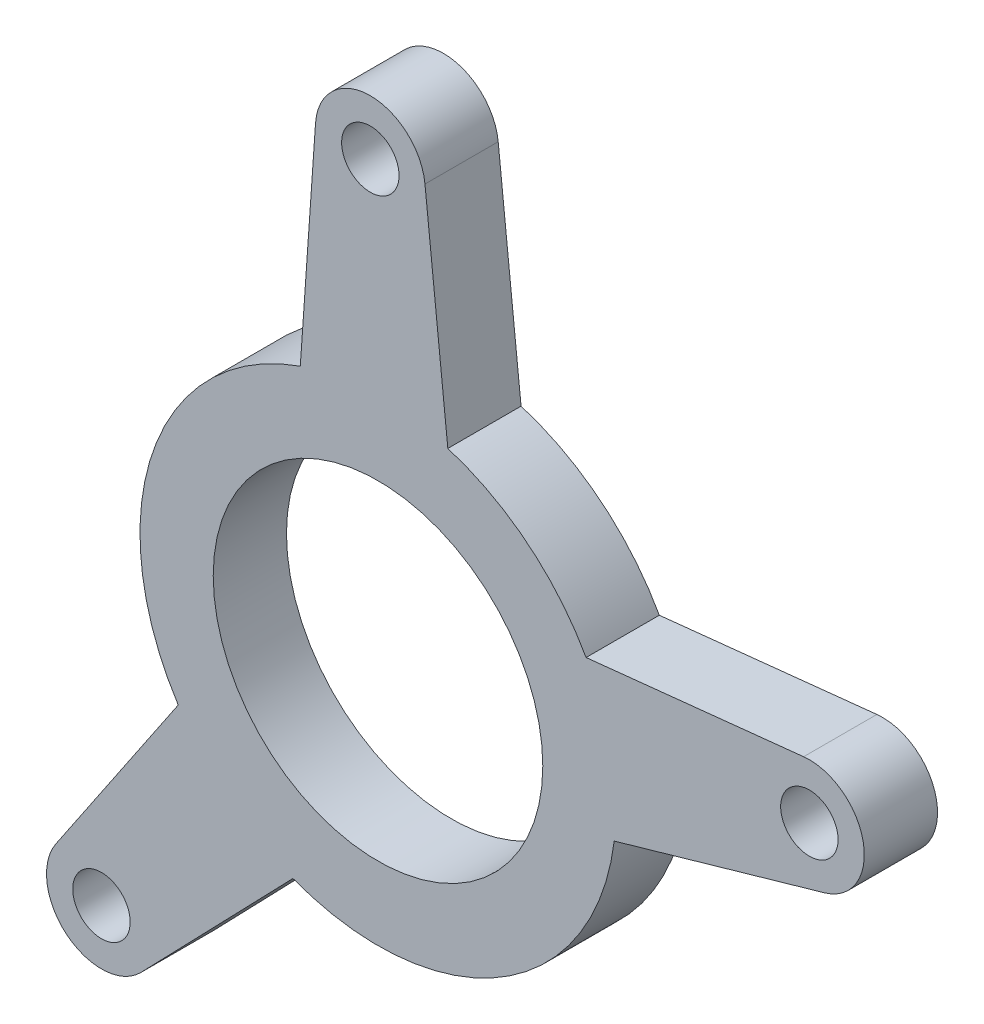
ISO-10303-21;
HEADER;
FILE_DESCRIPTION(('STEP AP214'),'2;1');
FILE_NAME('part.step','',(''),(''),'','','');
FILE_SCHEMA(('AUTOMOTIVE_DESIGN { 1 0 10303 214 1 1 1 1 }'));
ENDSEC;
DATA;
#1=APPLICATION_CONTEXT('core data for automotive mechanical design processes');
#2=APPLICATION_PROTOCOL_DEFINITION('international standard','automotive_design',2000,#1);
#3=PRODUCT_CONTEXT('',#1,'mechanical');
#4=PRODUCT('Part','Part','',(#3));
#5=PRODUCT_RELATED_PRODUCT_CATEGORY('part','',(#4));
#6=PRODUCT_DEFINITION_FORMATION('','',#4);
#7=PRODUCT_DEFINITION_CONTEXT('part definition',#1,'design');
#8=PRODUCT_DEFINITION('design','',#6,#7);
#9=PRODUCT_DEFINITION_SHAPE('','',#8);
#10=(LENGTH_UNIT() NAMED_UNIT(*) SI_UNIT(.MILLI.,.METRE.));
#11=(NAMED_UNIT(*) PLANE_ANGLE_UNIT() SI_UNIT($,.RADIAN.));
#12=(NAMED_UNIT(*) SI_UNIT($,.STERADIAN.) SOLID_ANGLE_UNIT());
#13=UNCERTAINTY_MEASURE_WITH_UNIT(LENGTH_MEASURE(1.E-05),#10,'distance_accuracy_value','');
#14=(GEOMETRIC_REPRESENTATION_CONTEXT(3) GLOBAL_UNCERTAINTY_ASSIGNED_CONTEXT((#13)) GLOBAL_UNIT_ASSIGNED_CONTEXT((#10,
#11,#12)) REPRESENTATION_CONTEXT('',''));
#15=CARTESIAN_POINT('',(0.,0.,0.));
#16=DIRECTION('',(0.,0.,1.));
#17=DIRECTION('',(1.,0.,0.));
#18=AXIS2_PLACEMENT_3D('',#15,#16,#17);
#19=CARTESIAN_POINT('',(526.007199618481,269.887157137107,3.175));
#20=DIRECTION('',(0.,0.,-1.));
#21=DIRECTION('',(-1.,0.,0.));
#22=AXIS2_PLACEMENT_3D('',#19,#20,#21);
#23=CYLINDRICAL_SURFACE('',#22,20.6375);
#24=CARTESIAN_POINT('',(526.007199618481,269.887157137107,-3.175));
#25=DIRECTION('',(0.,0.,1.));
#26=DIRECTION('',(1.,0.,0.));
#27=AXIS2_PLACEMENT_3D('',#24,#25,#26);
#28=CIRCLE('',#27,20.6375);
#29=CARTESIAN_POINT('',(544.046924011915,279.910866533281,-3.175));
#30=VERTEX_POINT('',#29);
#31=CARTESIAN_POINT('',(532.061197314276,289.616716639268,-3.175));
#32=VERTEX_POINT('',#31);
#33=EDGE_CURVE('E179',#30,#32,#28,.T.);
#34=ORIENTED_EDGE('',*,*,#33,.T.);
#35=DIRECTION('',(0.,0.,-1.));
#36=VECTOR('',#35,1.);
#37=CARTESIAN_POINT('',(532.061197314276,289.616716639268,3.175));
#38=LINE('',#37,#36);
#39=CARTESIAN_POINT('',(532.061197314276,289.616716639268,3.175));
#40=VERTEX_POINT('',#39);
#41=EDGE_CURVE('E11',#40,#32,#38,.T.);
#42=ORIENTED_EDGE('',*,*,#41,.F.);
#43=CARTESIAN_POINT('',(526.007199618481,269.887157137107,3.175));
#44=DIRECTION('',(0.,0.,1.));
#45=DIRECTION('',(1.,0.,0.));
#46=AXIS2_PLACEMENT_3D('',#43,#44,#45);
#47=CIRCLE('',#46,20.6375);
#48=CARTESIAN_POINT('',(544.046924011915,279.910866533281,3.175));
#49=VERTEX_POINT('',#48);
#50=EDGE_CURVE('E111',#49,#40,#47,.T.);
#51=ORIENTED_EDGE('',*,*,#50,.F.);
#52=DIRECTION('',(0.,0.,-1.));
#53=VECTOR('',#52,1.);
#54=CARTESIAN_POINT('',(544.046924011915,279.910866533281,3.175));
#55=LINE('',#54,#53);
#56=EDGE_CURVE('E175',#49,#30,#55,.T.);
#57=ORIENTED_EDGE('',*,*,#56,.T.);
#58=EDGE_LOOP('',(#34,#42,#51,#57));
#59=FACE_BOUND('',#58,.T.);
#60=ADVANCED_FACE('F43',(#59),#23,.T.);
#61=CARTESIAN_POINT('',(556.355141078171,58.4752816391382,3.175));
#62=DIRECTION('',(0.994521895368275,0.104528463267635,0.));
#63=DIRECTION('',(-0.104528463267635,0.994521895368275,0.));
#64=AXIS2_PLACEMENT_3D('',#61,#62,#63);
#65=PLANE('',#64);
#66=DIRECTION('',(0.104528463267635,-0.994521895368275,0.));
#67=VECTOR('',#66,1.);
#68=CARTESIAN_POINT('',(556.355141078171,58.4752816391382,-3.175));
#69=LINE('',#68,#67);
#70=CARTESIAN_POINT('',(530.078673459912,308.479171128878,-3.175));
#71=VERTEX_POINT('',#70);
#72=EDGE_CURVE('E182',#71,#32,#69,.T.);
#73=ORIENTED_EDGE('',*,*,#72,.F.);
#74=DIRECTION('',(0.,0.,-1.));
#75=VECTOR('',#74,1.);
#76=CARTESIAN_POINT('',(530.078673459912,308.479171128878,3.175));
#77=LINE('',#76,#75);
#78=CARTESIAN_POINT('',(530.078673459912,308.479171128878,3.175));
#79=VERTEX_POINT('',#78);
#80=EDGE_CURVE('E52',#79,#71,#77,.T.);
#81=ORIENTED_EDGE('',*,*,#80,.F.);
#82=DIRECTION('',(0.104528463267635,-0.994521895368275,0.));
#83=VECTOR('',#82,1.);
#84=CARTESIAN_POINT('',(556.355141078171,58.4752816391382,3.175));
#85=LINE('',#84,#83);
#86=EDGE_CURVE('E245',#79,#40,#85,.T.);
#87=ORIENTED_EDGE('',*,*,#86,.T.);
#88=ORIENTED_EDGE('',*,*,#41,.T.);
#89=EDGE_LOOP('',(#73,#81,#87,#88));
#90=FACE_BOUND('',#89,.T.);
#91=ADVANCED_FACE('F244',(#90),#65,.T.);
#92=CARTESIAN_POINT('',(525.342262933221,307.981354322566,3.175));
#93=DIRECTION('',(0.,0.,-1.));
#94=DIRECTION('',(-1.,0.,0.));
#95=AXIS2_PLACEMENT_3D('',#92,#93,#94);
#96=CYLINDRICAL_SURFACE('',#95,4.76250000000001);
#97=CARTESIAN_POINT('',(525.342262933221,307.981354322566,-3.175));
#98=DIRECTION('',(0.,0.,1.));
#99=DIRECTION('',(1.,0.,0.));
#100=AXIS2_PLACEMENT_3D('',#97,#98,#99);
#101=CIRCLE('',#100,4.76250000000001);
#102=CARTESIAN_POINT('',(520.591364143858,308.313569528772,-3.175));
#103=VERTEX_POINT('',#102);
#104=EDGE_CURVE('E187',#71,#103,#101,.T.);
#105=ORIENTED_EDGE('',*,*,#104,.T.);
#106=DIRECTION('',(0.,0.,-1.));
#107=VECTOR('',#106,1.);
#108=CARTESIAN_POINT('',(520.591364143858,308.313569528772,3.175));
#109=LINE('',#108,#107);
#110=CARTESIAN_POINT('',(520.591364143858,308.313569528772,3.175));
#111=VERTEX_POINT('',#110);
#112=EDGE_CURVE('E227',#111,#103,#109,.T.);
#113=ORIENTED_EDGE('',*,*,#112,.F.);
#114=CARTESIAN_POINT('',(525.342262933221,307.981354322566,3.175));
#115=DIRECTION('',(0.,0.,1.));
#116=DIRECTION('',(1.,0.,0.));
#117=AXIS2_PLACEMENT_3D('',#114,#115,#116);
#118=CIRCLE('',#117,4.76250000000001);
#119=EDGE_CURVE('E234',#79,#111,#118,.T.);
#120=ORIENTED_EDGE('',*,*,#119,.F.);
#121=ORIENTED_EDGE('',*,*,#80,.T.);
#122=EDGE_LOOP('',(#105,#113,#120,#121));
#123=FACE_BOUND('',#122,.T.);
#124=ADVANCED_FACE('F232',(#123),#96,.T.);
#125=CARTESIAN_POINT('',(496.603706689373,-34.7259140081209,3.175));
#126=DIRECTION('',(0.997564050259824,-0.069756473744131,0.));
#127=DIRECTION('',(0.069756473744131,0.997564050259824,0.));
#128=AXIS2_PLACEMENT_3D('',#125,#126,#127);
#129=PLANE('',#128);
#130=DIRECTION('',(-0.069756473744131,-0.997564050259824,0.));
#131=VECTOR('',#130,1.);
#132=CARTESIAN_POINT('',(496.603706689373,-34.7259140081209,-3.175));
#133=LINE('',#132,#131);
#134=CARTESIAN_POINT('',(519.268338157721,289.393416452073,-3.175));
#135=VERTEX_POINT('',#134);
#136=EDGE_CURVE('E189',#103,#135,#133,.T.);
#137=ORIENTED_EDGE('',*,*,#136,.T.);
#138=DIRECTION('',(0.,0.,-1.));
#139=VECTOR('',#138,1.);
#140=CARTESIAN_POINT('',(519.268338157721,289.393416452073,3.175));
#141=LINE('',#140,#139);
#142=CARTESIAN_POINT('',(519.268338157721,289.393416452073,3.175));
#143=VERTEX_POINT('',#142);
#144=EDGE_CURVE('E224',#143,#135,#141,.T.);
#145=ORIENTED_EDGE('',*,*,#144,.F.);
#146=DIRECTION('',(-0.069756473744131,-0.997564050259824,0.));
#147=VECTOR('',#146,1.);
#148=CARTESIAN_POINT('',(496.603706689373,-34.7259140081209,3.175));
#149=LINE('',#148,#147);
#150=EDGE_CURVE('E267',#111,#143,#149,.T.);
#151=ORIENTED_EDGE('',*,*,#150,.F.);
#152=ORIENTED_EDGE('',*,*,#112,.T.);
#153=EDGE_LOOP('',(#137,#145,#151,#152));
#154=FACE_BOUND('',#153,.T.);
#155=ADVANCED_FACE('F297',(#154),#129,.F.);
#156=CARTESIAN_POINT('',(508.687651932399,258.66487242322,-3.175));
#157=VERTEX_POINT('',#156);
#158=EDGE_CURVE('E184',#135,#157,#28,.T.);
#159=ORIENTED_EDGE('',*,*,#158,.T.);
#160=DIRECTION('',(0.,0.,-1.));
#161=VECTOR('',#160,1.);
#162=CARTESIAN_POINT('',(508.687651932399,258.66487242322,3.175));
#163=LINE('',#162,#161);
#164=CARTESIAN_POINT('',(508.687651932399,258.66487242322,3.175));
#165=VERTEX_POINT('',#164);
#166=EDGE_CURVE('E222',#165,#157,#163,.T.);
#167=ORIENTED_EDGE('',*,*,#166,.F.);
#168=EDGE_CURVE('E161',#143,#165,#47,.T.);
#169=ORIENTED_EDGE('',*,*,#168,.F.);
#170=ORIENTED_EDGE('',*,*,#144,.T.);
#171=EDGE_LOOP('',(#159,#167,#169,#170));
#172=FACE_BOUND('',#171,.T.);
#173=ADVANCED_FACE('F255',(#172),#23,.T.);
#174=CARTESIAN_POINT('',(229.707753440567,-154.939836080407,3.175));
#175=DIRECTION('',(-0.829037572555035,0.559192903470757,0.));
#176=DIRECTION('',(-0.559192903470757,-0.829037572555035,0.));
#177=AXIS2_PLACEMENT_3D('',#174,#175,#176);
#178=PLANE('',#177);
#179=DIRECTION('',(0.559192903470757,0.829037572555035,0.));
#180=VECTOR('',#179,1.);
#181=CARTESIAN_POINT('',(229.707753440567,-154.939836080407,-3.175));
#182=LINE('',#181,#180);
#183=CARTESIAN_POINT('',(498.081801280188,242.941052208377,-3.175));
#184=VERTEX_POINT('',#183);
#185=EDGE_CURVE('E191',#184,#157,#182,.T.);
#186=ORIENTED_EDGE('',*,*,#185,.F.);
#187=DIRECTION('',(0.,0.,-1.));
#188=VECTOR('',#187,1.);
#189=CARTESIAN_POINT('',(498.081801280188,242.941052208377,3.175));
#190=LINE('',#189,#188);
#191=CARTESIAN_POINT('',(498.081801280188,242.941052208377,3.175));
#192=VERTEX_POINT('',#191);
#193=EDGE_CURVE('E220',#192,#184,#190,.T.);
#194=ORIENTED_EDGE('',*,*,#193,.F.);
#195=DIRECTION('',(0.559192903470757,0.829037572555035,0.));
#196=VECTOR('',#195,1.);
#197=CARTESIAN_POINT('',(229.707753440567,-154.939836080407,3.175));
#198=LINE('',#197,#196);
#199=EDGE_CURVE('E264',#192,#165,#198,.T.);
#200=ORIENTED_EDGE('',*,*,#199,.T.);
#201=ORIENTED_EDGE('',*,*,#166,.T.);
#202=EDGE_LOOP('',(#186,#194,#200,#201));
#203=FACE_BOUND('',#202,.T.);
#204=ADVANCED_FACE('F261',(#203),#178,.T.);
#205=CARTESIAN_POINT('',(502.030092719482,240.277896005597,3.175));
#206=DIRECTION('',(0.,0.,-1.));
#207=DIRECTION('',(-1.,0.,0.));
#208=AXIS2_PLACEMENT_3D('',#205,#206,#207);
#209=CYLINDRICAL_SURFACE('',#208,4.76250000000001);
#210=CARTESIAN_POINT('',(502.030092719482,240.277896005597,-3.175));
#211=DIRECTION('',(0.,0.,1.));
#212=DIRECTION('',(1.,0.,0.));
#213=AXIS2_PLACEMENT_3D('',#210,#211,#212);
#214=CIRCLE('',#213,4.76250000000001);
#215=CARTESIAN_POINT('',(505.455948518595,236.969585516286,-3.175));
#216=VERTEX_POINT('',#215);
#217=EDGE_CURVE('E194',#184,#216,#214,.T.);
#218=ORIENTED_EDGE('',*,*,#217,.T.);
#219=DIRECTION('',(0.,0.,-1.));
#220=VECTOR('',#219,1.);
#221=CARTESIAN_POINT('',(505.455948518595,236.969585516286,3.175));
#222=LINE('',#221,#220);
#223=CARTESIAN_POINT('',(505.455948518595,236.969585516286,3.175));
#224=VERTEX_POINT('',#223);
#225=EDGE_CURVE('E217',#224,#216,#222,.T.);
#226=ORIENTED_EDGE('',*,*,#225,.F.);
#227=CARTESIAN_POINT('',(502.030092719482,240.277896005597,3.175));
#228=DIRECTION('',(0.,0.,1.));
#229=DIRECTION('',(1.,0.,0.));
#230=AXIS2_PLACEMENT_3D('',#227,#228,#229);
#231=CIRCLE('',#230,4.76250000000001);
#232=EDGE_CURVE('E265',#192,#224,#231,.T.);
#233=ORIENTED_EDGE('',*,*,#232,.F.);
#234=ORIENTED_EDGE('',*,*,#193,.T.);
#235=EDGE_LOOP('',(#218,#226,#233,#234));
#236=FACE_BOUND('',#235,.T.);
#237=ADVANCED_FACE('F304',(#236),#209,.T.);
#238=CARTESIAN_POINT('',(143.135438339842,-138.224286081876,3.175));
#239=DIRECTION('',(-0.71933980033865,0.694658370458998,0.));
#240=DIRECTION('',(-0.694658370458998,-0.71933980033865,0.));
#241=AXIS2_PLACEMENT_3D('',#238,#239,#240);
#242=PLANE('',#241);
#243=DIRECTION('',(0.694658370458998,0.71933980033865,0.));
#244=VECTOR('',#243,1.);
#245=CARTESIAN_POINT('',(143.135438339842,-138.224286081876,-3.175));
#246=LINE('',#245,#244);
#247=CARTESIAN_POINT('',(518.631085194451,250.61283893247,-3.175));
#248=VERTEX_POINT('',#247);
#249=EDGE_CURVE('E196',#216,#248,#246,.T.);
#250=ORIENTED_EDGE('',*,*,#249,.T.);
#251=DIRECTION('',(0.,0.,-1.));
#252=VECTOR('',#251,1.);
#253=CARTESIAN_POINT('',(518.631085194451,250.61283893247,3.175));
#254=LINE('',#253,#252);
#255=CARTESIAN_POINT('',(518.631085194451,250.61283893247,3.175));
#256=VERTEX_POINT('',#255);
#257=EDGE_CURVE('E214',#256,#248,#254,.T.);
#258=ORIENTED_EDGE('',*,*,#257,.F.);
#259=DIRECTION('',(0.694658370458998,0.71933980033865,0.));
#260=VECTOR('',#259,1.);
#261=CARTESIAN_POINT('',(143.135438339842,-138.224286081876,3.175));
#262=LINE('',#261,#260);
#263=EDGE_CURVE('E159',#224,#256,#262,.T.);
#264=ORIENTED_EDGE('',*,*,#263,.F.);
#265=ORIENTED_EDGE('',*,*,#225,.T.);
#266=EDGE_LOOP('',(#250,#258,#264,#265));
#267=FACE_BOUND('',#266,.T.);
#268=ADVANCED_FACE('F299',(#267),#242,.F.);
#269=CARTESIAN_POINT('',(546.488288447199,267.351135323292,-3.175));
#270=VERTEX_POINT('',#269);
#271=EDGE_CURVE('E183',#248,#270,#28,.T.);
#272=ORIENTED_EDGE('',*,*,#271,.T.);
#273=DIRECTION('',(0.,0.,-1.));
#274=VECTOR('',#273,1.);
#275=CARTESIAN_POINT('',(546.488288447199,267.351135323292,3.175));
#276=LINE('',#275,#274);
#277=CARTESIAN_POINT('',(546.488288447199,267.351135323292,3.175));
#278=VERTEX_POINT('',#277);
#279=EDGE_CURVE('E147',#278,#270,#276,.T.);
#280=ORIENTED_EDGE('',*,*,#279,.F.);
#281=EDGE_CURVE('E156',#256,#278,#47,.T.);
#282=ORIENTED_EDGE('',*,*,#281,.F.);
#283=ORIENTED_EDGE('',*,*,#257,.T.);
#284=EDGE_LOOP('',(#272,#280,#282,#283));
#285=FACE_BOUND('',#284,.T.);
#286=ADVANCED_FACE('F290',(#285),#23,.T.);
#287=CARTESIAN_POINT('',(-29.317290532332,102.241542456738,3.175));
#288=DIRECTION('',(0.275637355816992,-0.961261695938321,0.));
#289=DIRECTION('',(0.961261695938321,0.275637355816992,0.));
#290=AXIS2_PLACEMENT_3D('',#287,#288,#289);
#291=PLANE('',#290);
#292=DIRECTION('',(-0.961261695938321,-0.275637355816992,0.));
#293=VECTOR('',#292,1.);
#294=CARTESIAN_POINT('',(-29.317290532332,102.241542456738,-3.175));
#295=LINE('',#294,#293);
#296=CARTESIAN_POINT('',(564.719918214915,272.578971034048,-3.175));
#297=VERTEX_POINT('',#296);
#298=EDGE_CURVE('E146',#297,#270,#295,.T.);
#299=ORIENTED_EDGE('',*,*,#298,.F.);
#300=DIRECTION('',(0.,0.,-1.));
#301=VECTOR('',#300,1.);
#302=CARTESIAN_POINT('',(564.719918214915,272.578971034048,3.175));
#303=LINE('',#302,#301);
#304=CARTESIAN_POINT('',(564.719918214915,272.578971034048,3.175));
#305=VERTEX_POINT('',#304);
#306=EDGE_CURVE('E140',#305,#297,#303,.T.);
#307=ORIENTED_EDGE('',*,*,#306,.F.);
#308=DIRECTION('',(-0.961261695938321,-0.275637355816992,0.));
#309=VECTOR('',#308,1.);
#310=CARTESIAN_POINT('',(-29.317290532332,102.241542456738,3.175));
#311=LINE('',#310,#309);
#312=EDGE_CURVE('E144',#305,#278,#311,.T.);
#313=ORIENTED_EDGE('',*,*,#312,.T.);
#314=ORIENTED_EDGE('',*,*,#279,.T.);
#315=EDGE_LOOP('',(#299,#307,#313,#314));
#316=FACE_BOUND('',#315,.T.);
#317=ADVANCED_FACE('F142',(#316),#291,.T.);
#318=CARTESIAN_POINT('',(563.407195307837,277.156979860954,3.175));
#319=DIRECTION('',(0.,0.,-1.));
#320=DIRECTION('',(-1.,0.,0.));
#321=AXIS2_PLACEMENT_3D('',#318,#319,#320);
#322=CYLINDRICAL_SURFACE('',#321,4.76250000000001);
#323=CARTESIAN_POINT('',(563.407195307837,277.156979860954,-3.175));
#324=DIRECTION('',(0.,0.,1.));
#325=DIRECTION('',(1.,0.,0.));
#326=AXIS2_PLACEMENT_3D('',#323,#324,#325);
#327=CIRCLE('',#326,4.76250000000001);
#328=CARTESIAN_POINT('',(562.909378501525,281.893390387645,-3.175));
#329=VERTEX_POINT('',#328);
#330=EDGE_CURVE('E99',#297,#329,#327,.T.);
#331=ORIENTED_EDGE('',*,*,#330,.T.);
#332=DIRECTION('',(0.,0.,-1.));
#333=VECTOR('',#332,1.);
#334=CARTESIAN_POINT('',(562.909378501525,281.893390387645,3.175));
#335=LINE('',#334,#333);
#336=CARTESIAN_POINT('',(562.909378501525,281.893390387645,3.175));
#337=VERTEX_POINT('',#336);
#338=EDGE_CURVE('E148',#337,#329,#335,.T.);
#339=ORIENTED_EDGE('',*,*,#338,.F.);
#340=CARTESIAN_POINT('',(563.407195307837,277.156979860954,3.175));
#341=DIRECTION('',(0.,0.,1.));
#342=DIRECTION('',(1.,0.,0.));
#343=AXIS2_PLACEMENT_3D('',#340,#341,#342);
#344=CIRCLE('',#343,4.76250000000001);
#345=EDGE_CURVE('E150',#305,#337,#344,.T.);
#346=ORIENTED_EDGE('',*,*,#345,.F.);
#347=ORIENTED_EDGE('',*,*,#306,.T.);
#348=EDGE_LOOP('',(#331,#339,#346,#347));
#349=FACE_BOUND('',#348,.T.);
#350=ADVANCED_FACE('F151',(#349),#322,.T.);
#351=CARTESIAN_POINT('',(525.342262933221,307.981354322566,3.175));
#352=DIRECTION('',(0.,0.,-1.));
#353=DIRECTION('',(-1.,0.,0.));
#354=AXIS2_PLACEMENT_3D('',#351,#352,#353);
#355=CYLINDRICAL_SURFACE('',#354,2.48919999999995);
#356=CARTESIAN_POINT('',(525.342262933221,307.981354322566,3.175));
#357=DIRECTION('',(0.,0.,1.));
#358=DIRECTION('',(1.,0.,0.));
#359=AXIS2_PLACEMENT_3D('',#356,#357,#358);
#360=CIRCLE('',#359,2.48919999999995);
#361=CARTESIAN_POINT('',(527.831462933221,307.981354322566,3.175));
#362=VERTEX_POINT('',#361);
#363=EDGE_CURVE('E169',#362,#362,#360,.T.);
#364=ORIENTED_EDGE('',*,*,#363,.T.);
#365=EDGE_LOOP('',(#364));
#366=FACE_BOUND('',#365,.T.);
#367=CARTESIAN_POINT('',(525.342262933221,307.981354322566,-3.175));
#368=DIRECTION('',(0.,0.,1.));
#369=DIRECTION('',(1.,0.,0.));
#370=AXIS2_PLACEMENT_3D('',#367,#368,#369);
#371=CIRCLE('',#370,2.48919999999995);
#372=CARTESIAN_POINT('',(527.831462933221,307.981354322566,-3.175));
#373=VERTEX_POINT('',#372);
#374=EDGE_CURVE('E204',#373,#373,#371,.T.);
#375=ORIENTED_EDGE('',*,*,#374,.F.);
#376=EDGE_LOOP('',(#375));
#377=FACE_BOUND('',#376,.T.);
#378=ADVANCED_FACE('F366',(#366,#377),#355,.F.);
#379=CARTESIAN_POINT('',(563.407195307837,277.156979860954,3.175));
#380=DIRECTION('',(0.,0.,-1.));
#381=DIRECTION('',(-1.,0.,0.));
#382=AXIS2_PLACEMENT_3D('',#379,#380,#381);
#383=CYLINDRICAL_SURFACE('',#382,2.48919999999995);
#384=CARTESIAN_POINT('',(563.407195307837,277.156979860954,3.175));
#385=DIRECTION('',(0.,0.,1.));
#386=DIRECTION('',(1.,0.,0.));
#387=AXIS2_PLACEMENT_3D('',#384,#385,#386);
#388=CIRCLE('',#387,2.48919999999995);
#389=CARTESIAN_POINT('',(565.896395307837,277.156979860954,3.175));
#390=VERTEX_POINT('',#389);
#391=EDGE_CURVE('E166',#390,#390,#388,.T.);
#392=ORIENTED_EDGE('',*,*,#391,.T.);
#393=EDGE_LOOP('',(#392));
#394=FACE_BOUND('',#393,.T.);
#395=CARTESIAN_POINT('',(563.407195307837,277.156979860954,-3.175));
#396=DIRECTION('',(0.,0.,1.));
#397=DIRECTION('',(1.,0.,0.));
#398=AXIS2_PLACEMENT_3D('',#395,#396,#397);
#399=CIRCLE('',#398,2.48919999999995);
#400=CARTESIAN_POINT('',(565.896395307837,277.156979860954,-3.175));
#401=VERTEX_POINT('',#400);
#402=EDGE_CURVE('E201',#401,#401,#399,.T.);
#403=ORIENTED_EDGE('',*,*,#402,.F.);
#404=EDGE_LOOP('',(#403));
#405=FACE_BOUND('',#404,.T.);
#406=ADVANCED_FACE('F375',(#394,#405),#383,.F.);
#407=CARTESIAN_POINT('',(-23.154005468074,220.295646598301,3.175));
#408=DIRECTION('',(0.104528463267662,-0.994521895368273,0.));
#409=DIRECTION('',(0.994521895368273,0.104528463267662,0.));
#410=AXIS2_PLACEMENT_3D('',#407,#408,#409);
#411=PLANE('',#410);
#412=DIRECTION('',(-0.994521895368273,-0.104528463267662,0.));
#413=VECTOR('',#412,1.);
#414=CARTESIAN_POINT('',(-23.154005468074,220.295646598301,-3.175));
#415=LINE('',#414,#413);
#416=EDGE_CURVE('E105',#329,#30,#415,.T.);
#417=ORIENTED_EDGE('',*,*,#416,.T.);
#418=ORIENTED_EDGE('',*,*,#56,.F.);
#419=DIRECTION('',(-0.994521895368273,-0.104528463267662,0.));
#420=VECTOR('',#419,1.);
#421=CARTESIAN_POINT('',(-23.154005468074,220.295646598301,3.175));
#422=LINE('',#421,#420);
#423=EDGE_CURVE('E60',#337,#49,#422,.T.);
#424=ORIENTED_EDGE('',*,*,#423,.F.);
#425=ORIENTED_EDGE('',*,*,#338,.T.);
#426=EDGE_LOOP('',(#417,#418,#424,#425));
#427=FACE_BOUND('',#426,.T.);
#428=ADVANCED_FACE('F385',(#427),#411,.F.);
#429=CARTESIAN_POINT('',(526.007199618481,269.887157137107,3.175));
#430=DIRECTION('',(0.,0.,-1.));
#431=DIRECTION('',(-1.,0.,0.));
#432=AXIS2_PLACEMENT_3D('',#429,#430,#431);
#433=CYLINDRICAL_SURFACE('',#432,14.2875);
#434=CARTESIAN_POINT('',(526.007199618481,269.887157137107,3.175));
#435=DIRECTION('',(0.,0.,1.));
#436=DIRECTION('',(1.,0.,0.));
#437=AXIS2_PLACEMENT_3D('',#434,#435,#436);
#438=CIRCLE('',#437,14.2875);
#439=CARTESIAN_POINT('',(540.294699618481,269.887157137107,3.175));
#440=VERTEX_POINT('',#439);
#441=EDGE_CURVE('E210',#440,#440,#438,.T.);
#442=ORIENTED_EDGE('',*,*,#441,.T.);
#443=EDGE_LOOP('',(#442));
#444=FACE_BOUND('',#443,.T.);
#445=CARTESIAN_POINT('',(526.007199618481,269.887157137107,-3.175));
#446=DIRECTION('',(0.,0.,1.));
#447=DIRECTION('',(1.,0.,0.));
#448=AXIS2_PLACEMENT_3D('',#445,#446,#447);
#449=CIRCLE('',#448,14.2875);
#450=CARTESIAN_POINT('',(540.294699618481,269.887157137107,-3.175));
#451=VERTEX_POINT('',#450);
#452=EDGE_CURVE('E176',#451,#451,#449,.T.);
#453=ORIENTED_EDGE('',*,*,#452,.F.);
#454=EDGE_LOOP('',(#453));
#455=FACE_BOUND('',#454,.T.);
#456=ADVANCED_FACE('F45',(#444,#455),#433,.F.);
#457=CARTESIAN_POINT('',(502.030092719482,240.277896005597,3.175));
#458=DIRECTION('',(0.,0.,-1.));
#459=DIRECTION('',(-1.,0.,0.));
#460=AXIS2_PLACEMENT_3D('',#457,#458,#459);
#461=CYLINDRICAL_SURFACE('',#460,2.48919999999995);
#462=CARTESIAN_POINT('',(502.030092719482,240.277896005597,3.175));
#463=DIRECTION('',(0.,0.,1.));
#464=DIRECTION('',(1.,0.,0.));
#465=AXIS2_PLACEMENT_3D('',#462,#463,#464);
#466=CIRCLE('',#465,2.48919999999995);
#467=CARTESIAN_POINT('',(504.519292719482,240.277896005597,3.175));
#468=VERTEX_POINT('',#467);
#469=EDGE_CURVE('E172',#468,#468,#466,.T.);
#470=ORIENTED_EDGE('',*,*,#469,.T.);
#471=EDGE_LOOP('',(#470));
#472=FACE_BOUND('',#471,.T.);
#473=CARTESIAN_POINT('',(502.030092719482,240.277896005597,-3.175));
#474=DIRECTION('',(0.,0.,1.));
#475=DIRECTION('',(1.,0.,0.));
#476=AXIS2_PLACEMENT_3D('',#473,#474,#475);
#477=CIRCLE('',#476,2.48919999999995);
#478=CARTESIAN_POINT('',(504.519292719482,240.277896005597,-3.175));
#479=VERTEX_POINT('',#478);
#480=EDGE_CURVE('E207',#479,#479,#477,.T.);
#481=ORIENTED_EDGE('',*,*,#480,.F.);
#482=EDGE_LOOP('',(#481));
#483=FACE_BOUND('',#482,.T.);
#484=ADVANCED_FACE('F278',(#472,#483),#461,.F.);
#485=CARTESIAN_POINT('',(0.,0.,3.175));
#486=DIRECTION('',(0.,0.,1.));
#487=DIRECTION('',(1.,0.,0.));
#488=AXIS2_PLACEMENT_3D('',#485,#486,#487);
#489=PLANE('',#488);
#490=ORIENTED_EDGE('',*,*,#441,.F.);
#491=EDGE_LOOP('',(#490));
#492=FACE_BOUND('',#491,.T.);
#493=ORIENTED_EDGE('',*,*,#50,.T.);
#494=ORIENTED_EDGE('',*,*,#86,.F.);
#495=ORIENTED_EDGE('',*,*,#119,.T.);
#496=ORIENTED_EDGE('',*,*,#150,.T.);
#497=ORIENTED_EDGE('',*,*,#168,.T.);
#498=ORIENTED_EDGE('',*,*,#199,.F.);
#499=ORIENTED_EDGE('',*,*,#232,.T.);
#500=ORIENTED_EDGE('',*,*,#263,.T.);
#501=ORIENTED_EDGE('',*,*,#281,.T.);
#502=ORIENTED_EDGE('',*,*,#312,.F.);
#503=ORIENTED_EDGE('',*,*,#345,.T.);
#504=ORIENTED_EDGE('',*,*,#423,.T.);
#505=EDGE_LOOP('',(#493,#494,#495,#496,#497,#498,#499,#500,#501,#502,#503,#504));
#506=FACE_BOUND('',#505,.T.);
#507=ORIENTED_EDGE('',*,*,#391,.F.);
#508=EDGE_LOOP('',(#507));
#509=FACE_BOUND('',#508,.T.);
#510=ORIENTED_EDGE('',*,*,#363,.F.);
#511=EDGE_LOOP('',(#510));
#512=FACE_BOUND('',#511,.T.);
#513=ORIENTED_EDGE('',*,*,#469,.F.);
#514=EDGE_LOOP('',(#513));
#515=FACE_BOUND('',#514,.T.);
#516=ADVANCED_FACE('F153',(#492,#506,#509,#512,#515),#489,.T.);
#517=CARTESIAN_POINT('',(0.,0.,-3.175));
#518=DIRECTION('',(0.,0.,1.));
#519=DIRECTION('',(1.,0.,0.));
#520=AXIS2_PLACEMENT_3D('',#517,#518,#519);
#521=PLANE('',#520);
#522=ORIENTED_EDGE('',*,*,#452,.T.);
#523=EDGE_LOOP('',(#522));
#524=FACE_BOUND('',#523,.T.);
#525=ORIENTED_EDGE('',*,*,#33,.F.);
#526=ORIENTED_EDGE('',*,*,#416,.F.);
#527=ORIENTED_EDGE('',*,*,#330,.F.);
#528=ORIENTED_EDGE('',*,*,#298,.T.);
#529=ORIENTED_EDGE('',*,*,#271,.F.);
#530=ORIENTED_EDGE('',*,*,#249,.F.);
#531=ORIENTED_EDGE('',*,*,#217,.F.);
#532=ORIENTED_EDGE('',*,*,#185,.T.);
#533=ORIENTED_EDGE('',*,*,#158,.F.);
#534=ORIENTED_EDGE('',*,*,#136,.F.);
#535=ORIENTED_EDGE('',*,*,#104,.F.);
#536=ORIENTED_EDGE('',*,*,#72,.T.);
#537=EDGE_LOOP('',(#525,#526,#527,#528,#529,#530,#531,#532,#533,#534,#535,#536));
#538=FACE_BOUND('',#537,.T.);
#539=ORIENTED_EDGE('',*,*,#402,.T.);
#540=EDGE_LOOP('',(#539));
#541=FACE_BOUND('',#540,.T.);
#542=ORIENTED_EDGE('',*,*,#374,.T.);
#543=EDGE_LOOP('',(#542));
#544=FACE_BOUND('',#543,.T.);
#545=ORIENTED_EDGE('',*,*,#480,.T.);
#546=EDGE_LOOP('',(#545));
#547=FACE_BOUND('',#546,.T.);
#548=ADVANCED_FACE('F241',(#524,#538,#541,#544,#547),#521,.F.);
#549=CLOSED_SHELL('',(#60,#91,#124,#155,#173,#204,#237,#268,#286,#317,#350,#378,#406,#428,#456,
#484,#516,#548));
#550=MANIFOLD_SOLID_BREP('B2',#549);
#551=ADVANCED_BREP_SHAPE_REPRESENTATION('',(#18,#550),#14);
#552=SHAPE_DEFINITION_REPRESENTATION(#9,#551);
ENDSEC;
END-ISO-10303-21;
